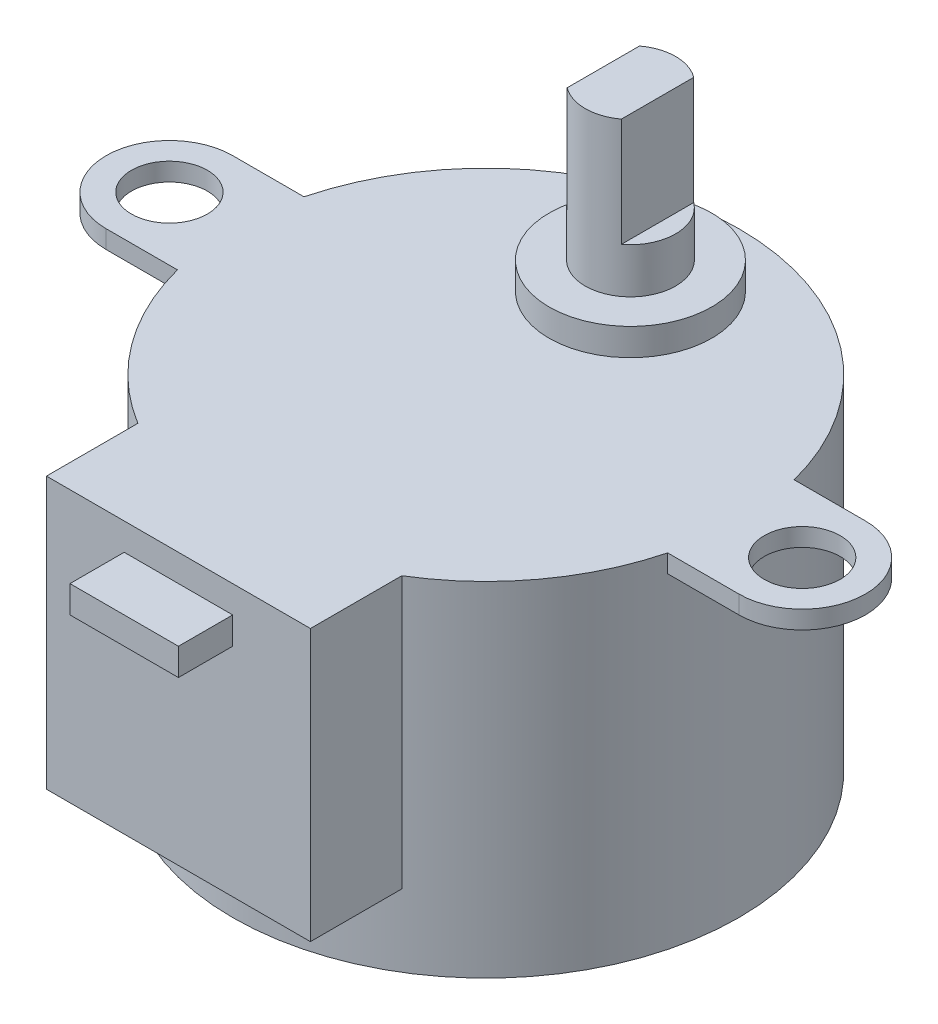
ISO-10303-21;
HEADER;
FILE_DESCRIPTION(('STEP AP214'),'2;1');
FILE_NAME('part.step','',(''),(''),'','','');
FILE_SCHEMA(('AUTOMOTIVE_DESIGN { 1 0 10303 214 1 1 1 1 }'));
ENDSEC;
DATA;
#1=APPLICATION_CONTEXT('core data for automotive mechanical design processes');
#2=APPLICATION_PROTOCOL_DEFINITION('international standard','automotive_design',2000,#1);
#3=PRODUCT_CONTEXT('',#1,'mechanical');
#4=PRODUCT('Part','Part','',(#3));
#5=PRODUCT_RELATED_PRODUCT_CATEGORY('part','',(#4));
#6=PRODUCT_DEFINITION_FORMATION('','',#4);
#7=PRODUCT_DEFINITION_CONTEXT('part definition',#1,'design');
#8=PRODUCT_DEFINITION('design','',#6,#7);
#9=PRODUCT_DEFINITION_SHAPE('','',#8);
#10=(LENGTH_UNIT() NAMED_UNIT(*) SI_UNIT(.MILLI.,.METRE.));
#11=(NAMED_UNIT(*) PLANE_ANGLE_UNIT() SI_UNIT($,.RADIAN.));
#12=(NAMED_UNIT(*) SI_UNIT($,.STERADIAN.) SOLID_ANGLE_UNIT());
#13=UNCERTAINTY_MEASURE_WITH_UNIT(LENGTH_MEASURE(1.E-05),#10,'distance_accuracy_value','');
#14=(GEOMETRIC_REPRESENTATION_CONTEXT(3) GLOBAL_UNCERTAINTY_ASSIGNED_CONTEXT((#13)) GLOBAL_UNIT_ASSIGNED_CONTEXT((#10,
#11,#12)) REPRESENTATION_CONTEXT('',''));
#15=CARTESIAN_POINT('',(0.,0.,0.));
#16=DIRECTION('',(0.,0.,1.));
#17=DIRECTION('',(1.,0.,0.));
#18=AXIS2_PLACEMENT_3D('',#15,#16,#17);
#19=CARTESIAN_POINT('',(-7.3,1.,17.));
#20=DIRECTION('',(0.,0.,-1.));
#21=DIRECTION('',(-1.,0.,0.));
#22=AXIS2_PLACEMENT_3D('',#19,#20,#21);
#23=PLANE('',#22);
#24=DIRECTION('',(0.,-1.,0.));
#25=VECTOR('',#24,1.);
#26=CARTESIAN_POINT('',(-7.3,1.,17.));
#27=LINE('',#26,#25);
#28=CARTESIAN_POINT('',(-7.3,1.,17.));
#29=VERTEX_POINT('',#28);
#30=CARTESIAN_POINT('',(-7.3,-14.,17.));
#31=VERTEX_POINT('',#30);
#32=EDGE_CURVE('E336',#29,#31,#27,.T.);
#33=ORIENTED_EDGE('',*,*,#32,.T.);
#34=DIRECTION('',(1.,0.,0.));
#35=VECTOR('',#34,1.);
#36=CARTESIAN_POINT('',(-7.3,-14.,17.));
#37=LINE('',#36,#35);
#38=CARTESIAN_POINT('',(7.3,-14.,17.));
#39=VERTEX_POINT('',#38);
#40=EDGE_CURVE('E249',#31,#39,#37,.T.);
#41=ORIENTED_EDGE('',*,*,#40,.T.);
#42=DIRECTION('',(0.,-1.,0.));
#43=VECTOR('',#42,1.);
#44=CARTESIAN_POINT('',(7.3,1.,17.));
#45=LINE('',#44,#43);
#46=CARTESIAN_POINT('',(7.3,1.,17.));
#47=VERTEX_POINT('',#46);
#48=EDGE_CURVE('E335',#47,#39,#45,.T.);
#49=ORIENTED_EDGE('',*,*,#48,.F.);
#50=DIRECTION('',(1.,0.,0.));
#51=VECTOR('',#50,1.);
#52=CARTESIAN_POINT('',(-7.3,1.,17.));
#53=LINE('',#52,#51);
#54=EDGE_CURVE('E276',#29,#47,#53,.T.);
#55=ORIENTED_EDGE('',*,*,#54,.F.);
#56=EDGE_LOOP('',(#33,#41,#49,#55));
#57=FACE_BOUND('',#56,.T.);
#58=DIRECTION('',(0.,-1.,0.));
#59=VECTOR('',#58,1.);
#60=CARTESIAN_POINT('',(-3.,-2.,17.));
#61=LINE('',#60,#59);
#62=CARTESIAN_POINT('',(-3.,-0.500000000000001,17.));
#63=VERTEX_POINT('',#62);
#64=CARTESIAN_POINT('',(-3.,-2.,17.));
#65=VERTEX_POINT('',#64);
#66=EDGE_CURVE('E201',#63,#65,#61,.T.);
#67=ORIENTED_EDGE('',*,*,#66,.F.);
#68=DIRECTION('',(-1.,0.,0.));
#69=VECTOR('',#68,1.);
#70=CARTESIAN_POINT('',(3.,-0.5,17.));
#71=LINE('',#70,#69);
#72=CARTESIAN_POINT('',(3.,-0.5,17.));
#73=VERTEX_POINT('',#72);
#74=EDGE_CURVE('E198',#73,#63,#71,.T.);
#75=ORIENTED_EDGE('',*,*,#74,.F.);
#76=DIRECTION('',(0.,1.,0.));
#77=VECTOR('',#76,1.);
#78=CARTESIAN_POINT('',(3.,-2.,17.));
#79=LINE('',#78,#77);
#80=CARTESIAN_POINT('',(3.,-2.,17.));
#81=VERTEX_POINT('',#80);
#82=EDGE_CURVE('E64',#81,#73,#79,.T.);
#83=ORIENTED_EDGE('',*,*,#82,.F.);
#84=DIRECTION('',(1.,0.,0.));
#85=VECTOR('',#84,1.);
#86=CARTESIAN_POINT('',(3.,-2.,17.));
#87=LINE('',#86,#85);
#88=EDGE_CURVE('E59',#65,#81,#87,.T.);
#89=ORIENTED_EDGE('',*,*,#88,.F.);
#90=EDGE_LOOP('',(#67,#75,#83,#89));
#91=FACE_BOUND('',#90,.T.);
#92=ADVANCED_FACE('F42',(#57,#91),#23,.F.);
#93=CARTESIAN_POINT('',(0.,5.,-8.));
#94=DIRECTION('',(0.,1.,0.));
#95=DIRECTION('',(0.,0.,1.));
#96=AXIS2_PLACEMENT_3D('',#93,#94,#95);
#97=PLANE('',#96);
#98=CARTESIAN_POINT('',(0.,5.,-8.));
#99=DIRECTION('',(0.,1.,0.));
#100=DIRECTION('',(0.,0.,1.));
#101=AXIS2_PLACEMENT_3D('',#98,#99,#100);
#102=CIRCLE('',#101,2.5);
#103=CARTESIAN_POINT('',(-1.5,5.,-10.));
#104=VERTEX_POINT('',#103);
#105=CARTESIAN_POINT('',(-1.5,5.,-6.));
#106=VERTEX_POINT('',#105);
#107=EDGE_CURVE('E232',#104,#106,#102,.T.);
#108=ORIENTED_EDGE('',*,*,#107,.T.);
#109=DIRECTION('',(0.,0.,-1.));
#110=VECTOR('',#109,1.);
#111=CARTESIAN_POINT('',(-1.5,5.,0.));
#112=LINE('',#111,#110);
#113=EDGE_CURVE('E202',#106,#104,#112,.T.);
#114=ORIENTED_EDGE('',*,*,#113,.T.);
#115=EDGE_LOOP('',(#108,#114));
#116=FACE_BOUND('',#115,.T.);
#117=ADVANCED_FACE('F398',(#116),#97,.T.);
#118=CARTESIAN_POINT('',(0.,-14.,0.));
#119=DIRECTION('',(0.,1.,0.));
#120=DIRECTION('',(0.,0.,1.));
#121=AXIS2_PLACEMENT_3D('',#118,#119,#120);
#122=PLANE('',#121);
#123=CARTESIAN_POINT('',(0.,-14.,0.));
#124=DIRECTION('',(0.,-1.,0.));
#125=DIRECTION('',(0.,0.,-1.));
#126=AXIS2_PLACEMENT_3D('',#123,#124,#125);
#127=CIRCLE('',#126,14.);
#128=CARTESIAN_POINT('',(7.3,-14.,11.9461290801665));
#129=VERTEX_POINT('',#128);
#130=CARTESIAN_POINT('',(-7.3,-14.,11.9461290801665));
#131=VERTEX_POINT('',#130);
#132=EDGE_CURVE('E239',#129,#131,#127,.T.);
#133=ORIENTED_EDGE('',*,*,#132,.F.);
#134=DIRECTION('',(0.,0.,-1.));
#135=VECTOR('',#134,1.);
#136=CARTESIAN_POINT('',(7.3,-14.,17.));
#137=LINE('',#136,#135);
#138=EDGE_CURVE('E252',#39,#129,#137,.T.);
#139=ORIENTED_EDGE('',*,*,#138,.F.);
#140=ORIENTED_EDGE('',*,*,#40,.F.);
#141=DIRECTION('',(0.,0.,1.));
#142=VECTOR('',#141,1.);
#143=CARTESIAN_POINT('',(-7.3,-14.,17.));
#144=LINE('',#143,#142);
#145=EDGE_CURVE('E245',#131,#31,#144,.T.);
#146=ORIENTED_EDGE('',*,*,#145,.F.);
#147=EDGE_LOOP('',(#133,#139,#140,#146));
#148=FACE_BOUND('',#147,.T.);
#149=ADVANCED_FACE('F396',(#148),#122,.F.);
#150=CARTESIAN_POINT('',(0.,0.,0.));
#151=DIRECTION('',(0.,1.,0.));
#152=DIRECTION('',(0.,0.,1.));
#153=AXIS2_PLACEMENT_3D('',#150,#151,#152);
#154=PLANE('',#153);
#155=CARTESIAN_POINT('',(17.5,0.,0.));
#156=DIRECTION('',(0.,1.,0.));
#157=DIRECTION('',(0.,0.,1.));
#158=AXIS2_PLACEMENT_3D('',#155,#156,#157);
#159=CIRCLE('',#158,2.1);
#160=CARTESIAN_POINT('',(17.5,0.,2.1));
#161=VERTEX_POINT('',#160);
#162=EDGE_CURVE('E255',#161,#161,#159,.T.);
#163=ORIENTED_EDGE('',*,*,#162,.T.);
#164=EDGE_LOOP('',(#163));
#165=FACE_BOUND('',#164,.T.);
#166=DIRECTION('',(1.,0.,0.));
#167=VECTOR('',#166,1.);
#168=CARTESIAN_POINT('',(13.555441711726,0.,3.5));
#169=LINE('',#168,#167);
#170=CARTESIAN_POINT('',(13.555441711726,0.,3.5));
#171=VERTEX_POINT('',#170);
#172=CARTESIAN_POINT('',(17.5,0.,3.5));
#173=VERTEX_POINT('',#172);
#174=EDGE_CURVE('E267',#171,#173,#169,.T.);
#175=ORIENTED_EDGE('',*,*,#174,.F.);
#176=CARTESIAN_POINT('',(0.,0.,0.));
#177=DIRECTION('',(0.,1.,0.));
#178=DIRECTION('',(0.,0.,1.));
#179=AXIS2_PLACEMENT_3D('',#176,#177,#178);
#180=CIRCLE('',#179,14.);
#181=CARTESIAN_POINT('',(13.555441711726,0.,-3.5));
#182=VERTEX_POINT('',#181);
#183=EDGE_CURVE('E51',#171,#182,#180,.T.);
#184=ORIENTED_EDGE('',*,*,#183,.T.);
#185=DIRECTION('',(-1.,0.,0.));
#186=VECTOR('',#185,1.);
#187=CARTESIAN_POINT('',(13.555441711726,0.,-3.5));
#188=LINE('',#187,#186);
#189=CARTESIAN_POINT('',(17.5,0.,-3.5));
#190=VERTEX_POINT('',#189);
#191=EDGE_CURVE('E300',#190,#182,#188,.T.);
#192=ORIENTED_EDGE('',*,*,#191,.F.);
#193=CARTESIAN_POINT('',(17.5,0.,0.));
#194=DIRECTION('',(0.,1.,0.));
#195=DIRECTION('',(0.,0.,1.));
#196=AXIS2_PLACEMENT_3D('',#193,#194,#195);
#197=CIRCLE('',#196,3.5);
#198=EDGE_CURVE('E298',#173,#190,#197,.T.);
#199=ORIENTED_EDGE('',*,*,#198,.F.);
#200=EDGE_LOOP('',(#175,#184,#192,#199));
#201=FACE_BOUND('',#200,.T.);
#202=ADVANCED_FACE('F382',(#165,#201),#154,.F.);
#203=CARTESIAN_POINT('',(0.,1.,0.));
#204=DIRECTION('',(0.,1.,0.));
#205=DIRECTION('',(0.,0.,1.));
#206=AXIS2_PLACEMENT_3D('',#203,#204,#205);
#207=PLANE('',#206);
#208=CARTESIAN_POINT('',(0.,1.,-8.));
#209=DIRECTION('',(0.,1.,0.));
#210=DIRECTION('',(0.,0.,1.));
#211=AXIS2_PLACEMENT_3D('',#208,#209,#210);
#212=CIRCLE('',#211,4.5);
#213=CARTESIAN_POINT('',(0.,1.,-3.5));
#214=VERTEX_POINT('',#213);
#215=EDGE_CURVE('E234',#214,#214,#212,.T.);
#216=ORIENTED_EDGE('',*,*,#215,.F.);
#217=EDGE_LOOP('',(#216));
#218=FACE_BOUND('',#217,.T.);
#219=CARTESIAN_POINT('',(-17.5,1.,0.));
#220=DIRECTION('',(0.,1.,0.));
#221=DIRECTION('',(0.,0.,1.));
#222=AXIS2_PLACEMENT_3D('',#219,#220,#221);
#223=CIRCLE('',#222,2.1);
#224=CARTESIAN_POINT('',(-17.5,1.,2.1));
#225=VERTEX_POINT('',#224);
#226=EDGE_CURVE('E264',#225,#225,#223,.T.);
#227=ORIENTED_EDGE('',*,*,#226,.F.);
#228=EDGE_LOOP('',(#227));
#229=FACE_BOUND('',#228,.T.);
#230=CARTESIAN_POINT('',(0.,1.,0.));
#231=DIRECTION('',(0.,1.,0.));
#232=DIRECTION('',(0.,0.,1.));
#233=AXIS2_PLACEMENT_3D('',#230,#231,#232);
#234=CIRCLE('',#233,14.);
#235=CARTESIAN_POINT('',(-13.555441711726,1.,3.5));
#236=VERTEX_POINT('',#235);
#237=CARTESIAN_POINT('',(-7.3,1.,11.9461290801665));
#238=VERTEX_POINT('',#237);
#239=EDGE_CURVE('E270',#236,#238,#234,.T.);
#240=ORIENTED_EDGE('',*,*,#239,.T.);
#241=DIRECTION('',(0.,0.,1.));
#242=VECTOR('',#241,1.);
#243=CARTESIAN_POINT('',(-7.3,1.,11.9461290801665));
#244=LINE('',#243,#242);
#245=EDGE_CURVE('E273',#238,#29,#244,.T.);
#246=ORIENTED_EDGE('',*,*,#245,.T.);
#247=ORIENTED_EDGE('',*,*,#54,.T.);
#248=DIRECTION('',(0.,0.,-1.));
#249=VECTOR('',#248,1.);
#250=CARTESIAN_POINT('',(7.3,1.,11.9461290801665));
#251=LINE('',#250,#249);
#252=CARTESIAN_POINT('',(7.3,1.,11.9461290801665));
#253=VERTEX_POINT('',#252);
#254=EDGE_CURVE('E278',#47,#253,#251,.T.);
#255=ORIENTED_EDGE('',*,*,#254,.T.);
#256=CARTESIAN_POINT('',(0.,1.,0.));
#257=DIRECTION('',(0.,1.,0.));
#258=DIRECTION('',(0.,0.,1.));
#259=AXIS2_PLACEMENT_3D('',#256,#257,#258);
#260=CIRCLE('',#259,14.);
#261=CARTESIAN_POINT('',(13.555441711726,1.,3.5));
#262=VERTEX_POINT('',#261);
#263=EDGE_CURVE('E280',#253,#262,#260,.T.);
#264=ORIENTED_EDGE('',*,*,#263,.T.);
#265=DIRECTION('',(1.,0.,0.));
#266=VECTOR('',#265,1.);
#267=CARTESIAN_POINT('',(13.555441711726,1.,3.5));
#268=LINE('',#267,#266);
#269=CARTESIAN_POINT('',(17.5,1.,3.5));
#270=VERTEX_POINT('',#269);
#271=EDGE_CURVE('E282',#262,#270,#268,.T.);
#272=ORIENTED_EDGE('',*,*,#271,.T.);
#273=CARTESIAN_POINT('',(17.5,1.,0.));
#274=DIRECTION('',(0.,1.,0.));
#275=DIRECTION('',(0.,0.,1.));
#276=AXIS2_PLACEMENT_3D('',#273,#274,#275);
#277=CIRCLE('',#276,3.5);
#278=CARTESIAN_POINT('',(17.5,1.,-3.5));
#279=VERTEX_POINT('',#278);
#280=EDGE_CURVE('E284',#270,#279,#277,.T.);
#281=ORIENTED_EDGE('',*,*,#280,.T.);
#282=DIRECTION('',(-1.,0.,0.));
#283=VECTOR('',#282,1.);
#284=CARTESIAN_POINT('',(13.555441711726,1.,-3.5));
#285=LINE('',#284,#283);
#286=CARTESIAN_POINT('',(13.555441711726,1.,-3.5));
#287=VERTEX_POINT('',#286);
#288=EDGE_CURVE('E286',#279,#287,#285,.T.);
#289=ORIENTED_EDGE('',*,*,#288,.T.);
#290=CARTESIAN_POINT('',(0.,1.,0.));
#291=DIRECTION('',(0.,1.,0.));
#292=DIRECTION('',(0.,0.,1.));
#293=AXIS2_PLACEMENT_3D('',#290,#291,#292);
#294=CIRCLE('',#293,14.);
#295=CARTESIAN_POINT('',(-13.555441711726,1.,-3.5));
#296=VERTEX_POINT('',#295);
#297=EDGE_CURVE('E288',#287,#296,#294,.T.);
#298=ORIENTED_EDGE('',*,*,#297,.T.);
#299=DIRECTION('',(-1.,0.,0.));
#300=VECTOR('',#299,1.);
#301=CARTESIAN_POINT('',(-17.5,1.,-3.5));
#302=LINE('',#301,#300);
#303=CARTESIAN_POINT('',(-17.5,1.,-3.5));
#304=VERTEX_POINT('',#303);
#305=EDGE_CURVE('E290',#296,#304,#302,.T.);
#306=ORIENTED_EDGE('',*,*,#305,.T.);
#307=CARTESIAN_POINT('',(-17.5,1.,0.));
#308=DIRECTION('',(0.,1.,0.));
#309=DIRECTION('',(0.,0.,1.));
#310=AXIS2_PLACEMENT_3D('',#307,#308,#309);
#311=CIRCLE('',#310,3.5);
#312=CARTESIAN_POINT('',(-17.5,1.,3.5));
#313=VERTEX_POINT('',#312);
#314=EDGE_CURVE('E292',#304,#313,#311,.T.);
#315=ORIENTED_EDGE('',*,*,#314,.T.);
#316=DIRECTION('',(1.,0.,0.));
#317=VECTOR('',#316,1.);
#318=CARTESIAN_POINT('',(-17.5,1.,3.5));
#319=LINE('',#318,#317);
#320=EDGE_CURVE('E294',#313,#236,#319,.T.);
#321=ORIENTED_EDGE('',*,*,#320,.T.);
#322=EDGE_LOOP('',(#240,#246,#247,#255,#264,#272,#281,#289,#298,#306,#315,#321));
#323=FACE_BOUND('',#322,.T.);
#324=CARTESIAN_POINT('',(17.5,1.,0.));
#325=DIRECTION('',(0.,1.,0.));
#326=DIRECTION('',(0.,0.,1.));
#327=AXIS2_PLACEMENT_3D('',#324,#325,#326);
#328=CIRCLE('',#327,2.1);
#329=CARTESIAN_POINT('',(17.5,1.,2.1));
#330=VERTEX_POINT('',#329);
#331=EDGE_CURVE('E258',#330,#330,#328,.T.);
#332=ORIENTED_EDGE('',*,*,#331,.F.);
#333=EDGE_LOOP('',(#332));
#334=FACE_BOUND('',#333,.T.);
#335=ADVANCED_FACE('F362',(#218,#229,#323,#334),#207,.T.);
#336=DIRECTION('',(-1.,0.,0.));
#337=VECTOR('',#336,1.);
#338=CARTESIAN_POINT('',(-17.5,0.,-3.5));
#339=LINE('',#338,#337);
#340=CARTESIAN_POINT('',(-13.555441711726,0.,-3.5));
#341=VERTEX_POINT('',#340);
#342=CARTESIAN_POINT('',(-17.5,0.,-3.5));
#343=VERTEX_POINT('',#342);
#344=EDGE_CURVE('E303',#341,#343,#339,.T.);
#345=ORIENTED_EDGE('',*,*,#344,.F.);
#346=CARTESIAN_POINT('',(-13.555441711726,0.,3.5));
#347=VERTEX_POINT('',#346);
#348=EDGE_CURVE('E257',#341,#347,#180,.T.);
#349=ORIENTED_EDGE('',*,*,#348,.T.);
#350=DIRECTION('',(1.,0.,0.));
#351=VECTOR('',#350,1.);
#352=CARTESIAN_POINT('',(-17.5,0.,3.5));
#353=LINE('',#352,#351);
#354=CARTESIAN_POINT('',(-17.5,0.,3.5));
#355=VERTEX_POINT('',#354);
#356=EDGE_CURVE('E274',#355,#347,#353,.T.);
#357=ORIENTED_EDGE('',*,*,#356,.F.);
#358=CARTESIAN_POINT('',(-17.5,0.,0.));
#359=DIRECTION('',(0.,1.,0.));
#360=DIRECTION('',(0.,0.,1.));
#361=AXIS2_PLACEMENT_3D('',#358,#359,#360);
#362=CIRCLE('',#361,3.5);
#363=EDGE_CURVE('E305',#343,#355,#362,.T.);
#364=ORIENTED_EDGE('',*,*,#363,.F.);
#365=EDGE_LOOP('',(#345,#349,#357,#364));
#366=FACE_BOUND('',#365,.T.);
#367=CARTESIAN_POINT('',(-17.5,0.,0.));
#368=DIRECTION('',(0.,1.,0.));
#369=DIRECTION('',(0.,0.,1.));
#370=AXIS2_PLACEMENT_3D('',#367,#368,#369);
#371=CIRCLE('',#370,2.1);
#372=CARTESIAN_POINT('',(-17.5,0.,2.1));
#373=VERTEX_POINT('',#372);
#374=EDGE_CURVE('E261',#373,#373,#371,.T.);
#375=ORIENTED_EDGE('',*,*,#374,.T.);
#376=EDGE_LOOP('',(#375));
#377=FACE_BOUND('',#376,.T.);
#378=ADVANCED_FACE('F348',(#366,#377),#154,.F.);
#379=CARTESIAN_POINT('',(-7.3,1.,11.9461290801665));
#380=DIRECTION('',(1.,0.,0.));
#381=DIRECTION('',(0.,0.,-1.));
#382=AXIS2_PLACEMENT_3D('',#379,#380,#381);
#383=PLANE('',#382);
#384=DIRECTION('',(0.,-1.,0.));
#385=VECTOR('',#384,1.);
#386=CARTESIAN_POINT('',(-7.3,1.,11.9461290801665));
#387=LINE('',#386,#385);
#388=EDGE_CURVE('E46',#238,#131,#387,.T.);
#389=ORIENTED_EDGE('',*,*,#388,.T.);
#390=ORIENTED_EDGE('',*,*,#145,.T.);
#391=ORIENTED_EDGE('',*,*,#32,.F.);
#392=ORIENTED_EDGE('',*,*,#245,.F.);
#393=EDGE_LOOP('',(#389,#390,#391,#392));
#394=FACE_BOUND('',#393,.T.);
#395=ADVANCED_FACE('F44',(#394),#383,.F.);
#396=CARTESIAN_POINT('',(7.3,1.,11.9461290801665));
#397=DIRECTION('',(-1.,0.,0.));
#398=DIRECTION('',(0.,0.,1.));
#399=AXIS2_PLACEMENT_3D('',#396,#397,#398);
#400=PLANE('',#399);
#401=ORIENTED_EDGE('',*,*,#48,.T.);
#402=ORIENTED_EDGE('',*,*,#138,.T.);
#403=DIRECTION('',(0.,-1.,0.));
#404=VECTOR('',#403,1.);
#405=CARTESIAN_POINT('',(7.3,1.,11.9461290801665));
#406=LINE('',#405,#404);
#407=EDGE_CURVE('E332',#253,#129,#406,.T.);
#408=ORIENTED_EDGE('',*,*,#407,.F.);
#409=ORIENTED_EDGE('',*,*,#254,.F.);
#410=EDGE_LOOP('',(#401,#402,#408,#409));
#411=FACE_BOUND('',#410,.T.);
#412=ADVANCED_FACE('F393',(#411),#400,.F.);
#413=CARTESIAN_POINT('',(13.555441711726,1.,3.5));
#414=DIRECTION('',(0.,0.,-1.));
#415=DIRECTION('',(-1.,0.,0.));
#416=AXIS2_PLACEMENT_3D('',#413,#414,#415);
#417=PLANE('',#416);
#418=ORIENTED_EDGE('',*,*,#174,.T.);
#419=DIRECTION('',(0.,-1.,0.));
#420=VECTOR('',#419,1.);
#421=CARTESIAN_POINT('',(17.5,1.,3.5));
#422=LINE('',#421,#420);
#423=EDGE_CURVE('E326',#270,#173,#422,.T.);
#424=ORIENTED_EDGE('',*,*,#423,.F.);
#425=ORIENTED_EDGE('',*,*,#271,.F.);
#426=DIRECTION('',(0.,-1.,0.));
#427=VECTOR('',#426,1.);
#428=CARTESIAN_POINT('',(13.555441711726,1.,3.5));
#429=LINE('',#428,#427);
#430=EDGE_CURVE('E329',#262,#171,#429,.T.);
#431=ORIENTED_EDGE('',*,*,#430,.T.);
#432=EDGE_LOOP('',(#418,#424,#425,#431));
#433=FACE_BOUND('',#432,.T.);
#434=ADVANCED_FACE('F387',(#433),#417,.F.);
#435=CARTESIAN_POINT('',(17.5,1.,0.));
#436=DIRECTION('',(0.,-1.,0.));
#437=DIRECTION('',(0.,0.,-1.));
#438=AXIS2_PLACEMENT_3D('',#435,#436,#437);
#439=CYLINDRICAL_SURFACE('',#438,3.5);
#440=ORIENTED_EDGE('',*,*,#198,.T.);
#441=DIRECTION('',(0.,-1.,0.));
#442=VECTOR('',#441,1.);
#443=CARTESIAN_POINT('',(17.5,1.,-3.5));
#444=LINE('',#443,#442);
#445=EDGE_CURVE('E323',#279,#190,#444,.T.);
#446=ORIENTED_EDGE('',*,*,#445,.F.);
#447=ORIENTED_EDGE('',*,*,#280,.F.);
#448=ORIENTED_EDGE('',*,*,#423,.T.);
#449=EDGE_LOOP('',(#440,#446,#447,#448));
#450=FACE_BOUND('',#449,.T.);
#451=ADVANCED_FACE('F483',(#450),#439,.T.);
#452=CARTESIAN_POINT('',(13.555441711726,1.,-3.5));
#453=DIRECTION('',(0.,0.,1.));
#454=DIRECTION('',(1.,0.,0.));
#455=AXIS2_PLACEMENT_3D('',#452,#453,#454);
#456=PLANE('',#455);
#457=ORIENTED_EDGE('',*,*,#191,.T.);
#458=DIRECTION('',(0.,-1.,0.));
#459=VECTOR('',#458,1.);
#460=CARTESIAN_POINT('',(13.555441711726,1.,-3.5));
#461=LINE('',#460,#459);
#462=EDGE_CURVE('E320',#287,#182,#461,.T.);
#463=ORIENTED_EDGE('',*,*,#462,.F.);
#464=ORIENTED_EDGE('',*,*,#288,.F.);
#465=ORIENTED_EDGE('',*,*,#445,.T.);
#466=EDGE_LOOP('',(#457,#463,#464,#465));
#467=FACE_BOUND('',#466,.T.);
#468=ADVANCED_FACE('F377',(#467),#456,.F.);
#469=CARTESIAN_POINT('',(0.,1.,0.));
#470=DIRECTION('',(0.,-1.,0.));
#471=DIRECTION('',(0.,0.,-1.));
#472=AXIS2_PLACEMENT_3D('',#469,#470,#471);
#473=CYLINDRICAL_SURFACE('',#472,14.);
#474=ORIENTED_EDGE('',*,*,#462,.T.);
#475=ORIENTED_EDGE('',*,*,#183,.F.);
#476=ORIENTED_EDGE('',*,*,#430,.F.);
#477=ORIENTED_EDGE('',*,*,#263,.F.);
#478=ORIENTED_EDGE('',*,*,#407,.T.);
#479=ORIENTED_EDGE('',*,*,#132,.T.);
#480=ORIENTED_EDGE('',*,*,#388,.F.);
#481=ORIENTED_EDGE('',*,*,#239,.F.);
#482=DIRECTION('',(0.,-1.,0.));
#483=VECTOR('',#482,1.);
#484=CARTESIAN_POINT('',(-13.555441711726,1.,3.5));
#485=LINE('',#484,#483);
#486=EDGE_CURVE('E296',#236,#347,#485,.T.);
#487=ORIENTED_EDGE('',*,*,#486,.T.);
#488=ORIENTED_EDGE('',*,*,#348,.F.);
#489=DIRECTION('',(0.,-1.,0.));
#490=VECTOR('',#489,1.);
#491=CARTESIAN_POINT('',(-13.555441711726,1.,-3.5));
#492=LINE('',#491,#490);
#493=EDGE_CURVE('E317',#296,#341,#492,.T.);
#494=ORIENTED_EDGE('',*,*,#493,.F.);
#495=ORIENTED_EDGE('',*,*,#297,.F.);
#496=EDGE_LOOP('',(#474,#475,#476,#477,#478,#479,#480,#481,#487,#488,#494,#495));
#497=FACE_BOUND('',#496,.T.);
#498=CARTESIAN_POINT('',(0.,-18.,0.));
#499=DIRECTION('',(0.,-1.,0.));
#500=DIRECTION('',(0.,0.,-1.));
#501=AXIS2_PLACEMENT_3D('',#498,#499,#500);
#502=CIRCLE('',#501,14.);
#503=CARTESIAN_POINT('',(0.,-18.,-14.));
#504=VERTEX_POINT('',#503);
#505=EDGE_CURVE('E242',#504,#504,#502,.T.);
#506=ORIENTED_EDGE('',*,*,#505,.F.);
#507=EDGE_LOOP('',(#506));
#508=FACE_BOUND('',#507,.T.);
#509=ADVANCED_FACE('F359',(#497,#508),#473,.T.);
#510=CARTESIAN_POINT('',(-17.5,1.,-3.5));
#511=DIRECTION('',(0.,0.,1.));
#512=DIRECTION('',(1.,0.,0.));
#513=AXIS2_PLACEMENT_3D('',#510,#511,#512);
#514=PLANE('',#513);
#515=ORIENTED_EDGE('',*,*,#344,.T.);
#516=DIRECTION('',(0.,-1.,0.));
#517=VECTOR('',#516,1.);
#518=CARTESIAN_POINT('',(-17.5,1.,-3.5));
#519=LINE('',#518,#517);
#520=EDGE_CURVE('E314',#304,#343,#519,.T.);
#521=ORIENTED_EDGE('',*,*,#520,.F.);
#522=ORIENTED_EDGE('',*,*,#305,.F.);
#523=ORIENTED_EDGE('',*,*,#493,.T.);
#524=EDGE_LOOP('',(#515,#521,#522,#523));
#525=FACE_BOUND('',#524,.T.);
#526=ADVANCED_FACE('F370',(#525),#514,.F.);
#527=CARTESIAN_POINT('',(-17.5,1.,0.));
#528=DIRECTION('',(0.,-1.,0.));
#529=DIRECTION('',(0.,0.,-1.));
#530=AXIS2_PLACEMENT_3D('',#527,#528,#529);
#531=CYLINDRICAL_SURFACE('',#530,3.5);
#532=ORIENTED_EDGE('',*,*,#363,.T.);
#533=DIRECTION('',(0.,-1.,0.));
#534=VECTOR('',#533,1.);
#535=CARTESIAN_POINT('',(-17.5,1.,3.5));
#536=LINE('',#535,#534);
#537=EDGE_CURVE('E311',#313,#355,#536,.T.);
#538=ORIENTED_EDGE('',*,*,#537,.F.);
#539=ORIENTED_EDGE('',*,*,#314,.F.);
#540=ORIENTED_EDGE('',*,*,#520,.T.);
#541=EDGE_LOOP('',(#532,#538,#539,#540));
#542=FACE_BOUND('',#541,.T.);
#543=ADVANCED_FACE('F368',(#542),#531,.T.);
#544=CARTESIAN_POINT('',(-17.5,1.,3.5));
#545=DIRECTION('',(0.,0.,-1.));
#546=DIRECTION('',(-1.,0.,0.));
#547=AXIS2_PLACEMENT_3D('',#544,#545,#546);
#548=PLANE('',#547);
#549=ORIENTED_EDGE('',*,*,#356,.T.);
#550=ORIENTED_EDGE('',*,*,#486,.F.);
#551=ORIENTED_EDGE('',*,*,#320,.F.);
#552=ORIENTED_EDGE('',*,*,#537,.T.);
#553=EDGE_LOOP('',(#549,#550,#551,#552));
#554=FACE_BOUND('',#553,.T.);
#555=ADVANCED_FACE('F355',(#554),#548,.F.);
#556=CARTESIAN_POINT('',(-17.5,1.,0.));
#557=DIRECTION('',(0.,-1.,0.));
#558=DIRECTION('',(0.,0.,-1.));
#559=AXIS2_PLACEMENT_3D('',#556,#557,#558);
#560=CYLINDRICAL_SURFACE('',#559,2.1);
#561=ORIENTED_EDGE('',*,*,#226,.T.);
#562=EDGE_LOOP('',(#561));
#563=FACE_BOUND('',#562,.T.);
#564=ORIENTED_EDGE('',*,*,#374,.F.);
#565=EDGE_LOOP('',(#564));
#566=FACE_BOUND('',#565,.T.);
#567=ADVANCED_FACE('F463',(#563,#566),#560,.F.);
#568=CARTESIAN_POINT('',(17.5,1.,0.));
#569=DIRECTION('',(0.,-1.,0.));
#570=DIRECTION('',(0.,0.,-1.));
#571=AXIS2_PLACEMENT_3D('',#568,#569,#570);
#572=CYLINDRICAL_SURFACE('',#571,2.1);
#573=ORIENTED_EDGE('',*,*,#331,.T.);
#574=EDGE_LOOP('',(#573));
#575=FACE_BOUND('',#574,.T.);
#576=ORIENTED_EDGE('',*,*,#162,.F.);
#577=EDGE_LOOP('',(#576));
#578=FACE_BOUND('',#577,.T.);
#579=ADVANCED_FACE('F457',(#575,#578),#572,.F.);
#580=CARTESIAN_POINT('',(0.,-18.,0.));
#581=DIRECTION('',(0.,-1.,0.));
#582=DIRECTION('',(0.,0.,-1.));
#583=AXIS2_PLACEMENT_3D('',#580,#581,#582);
#584=PLANE('',#583);
#585=ORIENTED_EDGE('',*,*,#505,.T.);
#586=EDGE_LOOP('',(#585));
#587=FACE_BOUND('',#586,.T.);
#588=ADVANCED_FACE('F453',(#587),#584,.T.);
#589=CARTESIAN_POINT('',(0.,2.5,-8.));
#590=DIRECTION('',(0.,-1.,0.));
#591=DIRECTION('',(0.,0.,-1.));
#592=AXIS2_PLACEMENT_3D('',#589,#590,#591);
#593=CYLINDRICAL_SURFACE('',#592,4.5);
#594=CARTESIAN_POINT('',(0.,2.5,-8.));
#595=DIRECTION('',(0.,1.,0.));
#596=DIRECTION('',(0.,0.,1.));
#597=AXIS2_PLACEMENT_3D('',#594,#595,#596);
#598=CIRCLE('',#597,4.5);
#599=CARTESIAN_POINT('',(0.,2.5,-3.5));
#600=VERTEX_POINT('',#599);
#601=EDGE_CURVE('E236',#600,#600,#598,.T.);
#602=ORIENTED_EDGE('',*,*,#601,.F.);
#603=EDGE_LOOP('',(#602));
#604=FACE_BOUND('',#603,.T.);
#605=ORIENTED_EDGE('',*,*,#215,.T.);
#606=EDGE_LOOP('',(#605));
#607=FACE_BOUND('',#606,.T.);
#608=ADVANCED_FACE('F449',(#604,#607),#593,.T.);
#609=CARTESIAN_POINT('',(0.,2.5,-8.));
#610=DIRECTION('',(0.,1.,0.));
#611=DIRECTION('',(0.,0.,1.));
#612=AXIS2_PLACEMENT_3D('',#609,#610,#611);
#613=PLANE('',#612);
#614=CARTESIAN_POINT('',(0.,2.5,-8.));
#615=DIRECTION('',(0.,1.,0.));
#616=DIRECTION('',(0.,0.,1.));
#617=AXIS2_PLACEMENT_3D('',#614,#615,#616);
#618=CIRCLE('',#617,2.5);
#619=CARTESIAN_POINT('',(0.,2.5,-5.5));
#620=VERTEX_POINT('',#619);
#621=EDGE_CURVE('E11',#620,#620,#618,.T.);
#622=ORIENTED_EDGE('',*,*,#621,.F.);
#623=EDGE_LOOP('',(#622));
#624=FACE_BOUND('',#623,.T.);
#625=ORIENTED_EDGE('',*,*,#601,.T.);
#626=EDGE_LOOP('',(#625));
#627=FACE_BOUND('',#626,.T.);
#628=ADVANCED_FACE('F445',(#624,#627),#613,.T.);
#629=CARTESIAN_POINT('',(0.,5.,-8.));
#630=DIRECTION('',(0.,-1.,0.));
#631=DIRECTION('',(0.,0.,-1.));
#632=AXIS2_PLACEMENT_3D('',#629,#630,#631);
#633=CYLINDRICAL_SURFACE('',#632,2.5);
#634=CARTESIAN_POINT('',(1.5,5.,-6.));
#635=VERTEX_POINT('',#634);
#636=CARTESIAN_POINT('',(1.5,5.,-10.));
#637=VERTEX_POINT('',#636);
#638=EDGE_CURVE('E233',#635,#637,#102,.T.);
#639=ORIENTED_EDGE('',*,*,#638,.F.);
#640=DIRECTION('',(0.,-1.,0.));
#641=VECTOR('',#640,1.);
#642=CARTESIAN_POINT('',(1.5,11.,-6.));
#643=LINE('',#642,#641);
#644=CARTESIAN_POINT('',(1.5,11.,-6.));
#645=VERTEX_POINT('',#644);
#646=EDGE_CURVE('E226',#645,#635,#643,.T.);
#647=ORIENTED_EDGE('',*,*,#646,.F.);
#648=CARTESIAN_POINT('',(0.,11.,-8.));
#649=DIRECTION('',(0.,1.,0.));
#650=DIRECTION('',(0.,0.,1.));
#651=AXIS2_PLACEMENT_3D('',#648,#649,#650);
#652=CIRCLE('',#651,2.5);
#653=CARTESIAN_POINT('',(-1.5,11.,-6.));
#654=VERTEX_POINT('',#653);
#655=EDGE_CURVE('E213',#654,#645,#652,.T.);
#656=ORIENTED_EDGE('',*,*,#655,.F.);
#657=DIRECTION('',(0.,-1.,0.));
#658=VECTOR('',#657,1.);
#659=CARTESIAN_POINT('',(-1.5,11.,-6.));
#660=LINE('',#659,#658);
#661=EDGE_CURVE('E229',#654,#106,#660,.T.);
#662=ORIENTED_EDGE('',*,*,#661,.T.);
#663=ORIENTED_EDGE('',*,*,#107,.F.);
#664=DIRECTION('',(0.,-1.,0.));
#665=VECTOR('',#664,1.);
#666=CARTESIAN_POINT('',(-1.5,11.,-10.));
#667=LINE('',#666,#665);
#668=CARTESIAN_POINT('',(-1.5,11.,-10.));
#669=VERTEX_POINT('',#668);
#670=EDGE_CURVE('E220',#669,#104,#667,.T.);
#671=ORIENTED_EDGE('',*,*,#670,.F.);
#672=CARTESIAN_POINT('',(1.5,11.,-10.));
#673=VERTEX_POINT('',#672);
#674=EDGE_CURVE('E216',#673,#669,#652,.T.);
#675=ORIENTED_EDGE('',*,*,#674,.F.);
#676=DIRECTION('',(0.,-1.,0.));
#677=VECTOR('',#676,1.);
#678=CARTESIAN_POINT('',(1.5,11.,-10.));
#679=LINE('',#678,#677);
#680=EDGE_CURVE('E223',#673,#637,#679,.T.);
#681=ORIENTED_EDGE('',*,*,#680,.T.);
#682=EDGE_LOOP('',(#639,#647,#656,#662,#663,#671,#675,#681));
#683=FACE_BOUND('',#682,.T.);
#684=ORIENTED_EDGE('',*,*,#621,.T.);
#685=EDGE_LOOP('',(#684));
#686=FACE_BOUND('',#685,.T.);
#687=ADVANCED_FACE('F441',(#683,#686),#633,.T.);
#688=DIRECTION('',(0.,0.,-1.));
#689=VECTOR('',#688,1.);
#690=CARTESIAN_POINT('',(1.5,5.,0.));
#691=LINE('',#690,#689);
#692=EDGE_CURVE('E204',#635,#637,#691,.T.);
#693=ORIENTED_EDGE('',*,*,#692,.F.);
#694=ORIENTED_EDGE('',*,*,#638,.T.);
#695=EDGE_LOOP('',(#693,#694));
#696=FACE_BOUND('',#695,.T.);
#697=ADVANCED_FACE('F437',(#696),#97,.T.);
#698=CARTESIAN_POINT('',(-1.5,11.,0.));
#699=DIRECTION('',(-1.,0.,0.));
#700=DIRECTION('',(0.,0.,1.));
#701=AXIS2_PLACEMENT_3D('',#698,#699,#700);
#702=PLANE('',#701);
#703=ORIENTED_EDGE('',*,*,#113,.F.);
#704=ORIENTED_EDGE('',*,*,#661,.F.);
#705=DIRECTION('',(0.,0.,-1.));
#706=VECTOR('',#705,1.);
#707=CARTESIAN_POINT('',(-1.5,11.,0.));
#708=LINE('',#707,#706);
#709=EDGE_CURVE('E210',#654,#669,#708,.T.);
#710=ORIENTED_EDGE('',*,*,#709,.T.);
#711=ORIENTED_EDGE('',*,*,#670,.T.);
#712=EDGE_LOOP('',(#703,#704,#710,#711));
#713=FACE_BOUND('',#712,.T.);
#714=ADVANCED_FACE('F433',(#713),#702,.T.);
#715=CARTESIAN_POINT('',(1.5,11.,0.));
#716=DIRECTION('',(-1.,0.,0.));
#717=DIRECTION('',(0.,0.,1.));
#718=AXIS2_PLACEMENT_3D('',#715,#716,#717);
#719=PLANE('',#718);
#720=ORIENTED_EDGE('',*,*,#692,.T.);
#721=ORIENTED_EDGE('',*,*,#680,.F.);
#722=DIRECTION('',(0.,0.,-1.));
#723=VECTOR('',#722,1.);
#724=CARTESIAN_POINT('',(1.5,11.,0.));
#725=LINE('',#724,#723);
#726=EDGE_CURVE('E215',#645,#673,#725,.T.);
#727=ORIENTED_EDGE('',*,*,#726,.F.);
#728=ORIENTED_EDGE('',*,*,#646,.T.);
#729=EDGE_LOOP('',(#720,#721,#727,#728));
#730=FACE_BOUND('',#729,.T.);
#731=ADVANCED_FACE('F429',(#730),#719,.F.);
#732=CARTESIAN_POINT('',(0.,11.,0.));
#733=DIRECTION('',(0.,1.,0.));
#734=DIRECTION('',(0.,0.,1.));
#735=AXIS2_PLACEMENT_3D('',#732,#733,#734);
#736=PLANE('',#735);
#737=ORIENTED_EDGE('',*,*,#709,.F.);
#738=ORIENTED_EDGE('',*,*,#655,.T.);
#739=ORIENTED_EDGE('',*,*,#726,.T.);
#740=ORIENTED_EDGE('',*,*,#674,.T.);
#741=EDGE_LOOP('',(#737,#738,#739,#740));
#742=FACE_BOUND('',#741,.T.);
#743=ADVANCED_FACE('F426',(#742),#736,.T.);
#744=CARTESIAN_POINT('',(-3.,-2.,20.));
#745=DIRECTION('',(1.,0.,0.));
#746=DIRECTION('',(0.,0.,-1.));
#747=AXIS2_PLACEMENT_3D('',#744,#745,#746);
#748=PLANE('',#747);
#749=ORIENTED_EDGE('',*,*,#66,.T.);
#750=DIRECTION('',(0.,0.,-1.));
#751=VECTOR('',#750,1.);
#752=CARTESIAN_POINT('',(-3.,-2.,20.));
#753=LINE('',#752,#751);
#754=CARTESIAN_POINT('',(-3.,-2.,20.));
#755=VERTEX_POINT('',#754);
#756=EDGE_CURVE('E182',#755,#65,#753,.T.);
#757=ORIENTED_EDGE('',*,*,#756,.F.);
#758=DIRECTION('',(0.,-1.,0.));
#759=VECTOR('',#758,1.);
#760=CARTESIAN_POINT('',(-3.,-2.,20.));
#761=LINE('',#760,#759);
#762=CARTESIAN_POINT('',(-3.,-0.500000000000001,20.));
#763=VERTEX_POINT('',#762);
#764=EDGE_CURVE('E189',#763,#755,#761,.T.);
#765=ORIENTED_EDGE('',*,*,#764,.F.);
#766=DIRECTION('',(0.,0.,-1.));
#767=VECTOR('',#766,1.);
#768=CARTESIAN_POINT('',(-3.,-0.500000000000001,20.));
#769=LINE('',#768,#767);
#770=EDGE_CURVE('E404',#763,#63,#769,.T.);
#771=ORIENTED_EDGE('',*,*,#770,.T.);
#772=EDGE_LOOP('',(#749,#757,#765,#771));
#773=FACE_BOUND('',#772,.T.);
#774=ADVANCED_FACE('F200',(#773),#748,.F.);
#775=CARTESIAN_POINT('',(3.,-2.,20.));
#776=DIRECTION('',(0.,1.,0.));
#777=DIRECTION('',(-1.,0.,0.));
#778=AXIS2_PLACEMENT_3D('',#775,#776,#777);
#779=PLANE('',#778);
#780=ORIENTED_EDGE('',*,*,#88,.T.);
#781=DIRECTION('',(0.,0.,-1.));
#782=VECTOR('',#781,1.);
#783=CARTESIAN_POINT('',(3.,-2.,20.));
#784=LINE('',#783,#782);
#785=CARTESIAN_POINT('',(3.,-2.,20.));
#786=VERTEX_POINT('',#785);
#787=EDGE_CURVE('E185',#786,#81,#784,.T.);
#788=ORIENTED_EDGE('',*,*,#787,.F.);
#789=DIRECTION('',(1.,0.,0.));
#790=VECTOR('',#789,1.);
#791=CARTESIAN_POINT('',(3.,-2.,20.));
#792=LINE('',#791,#790);
#793=EDGE_CURVE('E178',#755,#786,#792,.T.);
#794=ORIENTED_EDGE('',*,*,#793,.F.);
#795=ORIENTED_EDGE('',*,*,#756,.T.);
#796=EDGE_LOOP('',(#780,#788,#794,#795));
#797=FACE_BOUND('',#796,.T.);
#798=ADVANCED_FACE('F180',(#797),#779,.F.);
#799=CARTESIAN_POINT('',(3.,-2.,20.));
#800=DIRECTION('',(-1.,0.,0.));
#801=DIRECTION('',(0.,-1.,0.));
#802=AXIS2_PLACEMENT_3D('',#799,#800,#801);
#803=PLANE('',#802);
#804=ORIENTED_EDGE('',*,*,#82,.T.);
#805=DIRECTION('',(0.,0.,-1.));
#806=VECTOR('',#805,1.);
#807=CARTESIAN_POINT('',(3.,-0.5,20.));
#808=LINE('',#807,#806);
#809=CARTESIAN_POINT('',(3.,-0.5,20.));
#810=VERTEX_POINT('',#809);
#811=EDGE_CURVE('E206',#810,#73,#808,.T.);
#812=ORIENTED_EDGE('',*,*,#811,.F.);
#813=DIRECTION('',(0.,1.,0.));
#814=VECTOR('',#813,1.);
#815=CARTESIAN_POINT('',(3.,-2.,20.));
#816=LINE('',#815,#814);
#817=EDGE_CURVE('E188',#786,#810,#816,.T.);
#818=ORIENTED_EDGE('',*,*,#817,.F.);
#819=ORIENTED_EDGE('',*,*,#787,.T.);
#820=EDGE_LOOP('',(#804,#812,#818,#819));
#821=FACE_BOUND('',#820,.T.);
#822=ADVANCED_FACE('F413',(#821),#803,.F.);
#823=CARTESIAN_POINT('',(3.,-0.5,20.));
#824=DIRECTION('',(0.,-1.,0.));
#825=DIRECTION('',(1.,0.,0.));
#826=AXIS2_PLACEMENT_3D('',#823,#824,#825);
#827=PLANE('',#826);
#828=ORIENTED_EDGE('',*,*,#74,.T.);
#829=ORIENTED_EDGE('',*,*,#770,.F.);
#830=DIRECTION('',(-1.,0.,0.));
#831=VECTOR('',#830,1.);
#832=CARTESIAN_POINT('',(3.,-0.5,20.));
#833=LINE('',#832,#831);
#834=EDGE_CURVE('E194',#810,#763,#833,.T.);
#835=ORIENTED_EDGE('',*,*,#834,.F.);
#836=ORIENTED_EDGE('',*,*,#811,.T.);
#837=EDGE_LOOP('',(#828,#829,#835,#836));
#838=FACE_BOUND('',#837,.T.);
#839=ADVANCED_FACE('F403',(#838),#827,.F.);
#840=CARTESIAN_POINT('',(0.,0.,20.));
#841=DIRECTION('',(0.,0.,1.));
#842=DIRECTION('',(1.,0.,0.));
#843=AXIS2_PLACEMENT_3D('',#840,#841,#842);
#844=PLANE('',#843);
#845=ORIENTED_EDGE('',*,*,#764,.T.);
#846=ORIENTED_EDGE('',*,*,#793,.T.);
#847=ORIENTED_EDGE('',*,*,#817,.T.);
#848=ORIENTED_EDGE('',*,*,#834,.T.);
#849=EDGE_LOOP('',(#845,#846,#847,#848));
#850=FACE_BOUND('',#849,.T.);
#851=ADVANCED_FACE('F192',(#850),#844,.T.);
#852=CLOSED_SHELL('',(#92,#117,#149,#202,#335,#378,#395,#412,#434,#451,#468,#509,#526,#543,#555,
#567,#579,#588,#608,#628,#687,#697,#714,#731,#743,#774,#798,#822,#839,#851));
#853=MANIFOLD_SOLID_BREP('B2',#852);
#854=ADVANCED_BREP_SHAPE_REPRESENTATION('',(#18,#853),#14);
#855=SHAPE_DEFINITION_REPRESENTATION(#9,#854);
ENDSEC;
END-ISO-10303-21;
